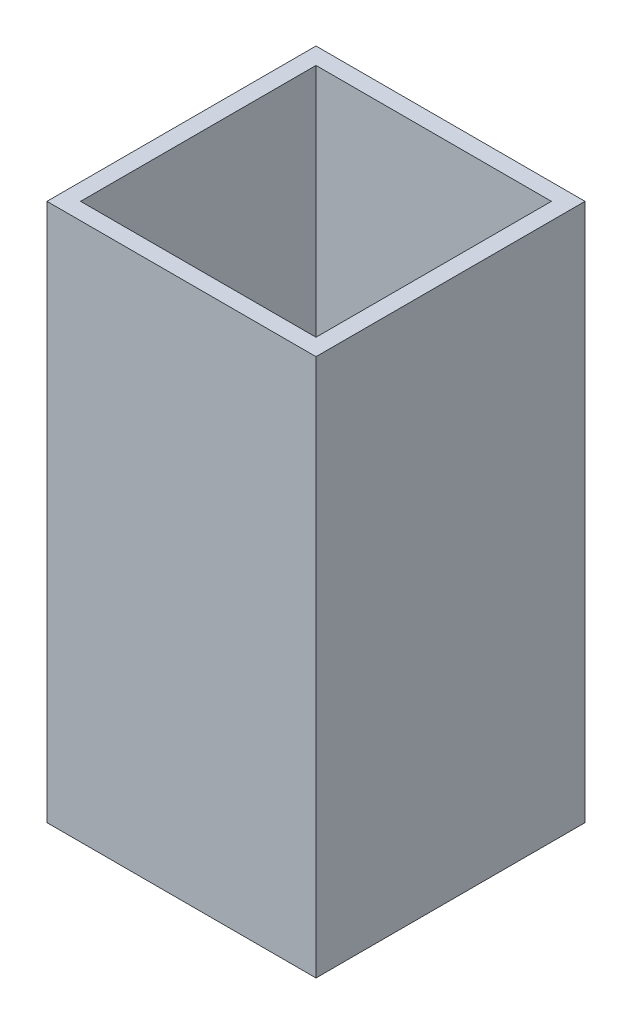
ISO-10303-21;
HEADER;
FILE_DESCRIPTION(('STEP AP214'),'2;1');
FILE_NAME('part.step','',(''),(''),'','','');
FILE_SCHEMA(('AUTOMOTIVE_DESIGN { 1 0 10303 214 1 1 1 1 }'));
ENDSEC;
DATA;
#1=APPLICATION_CONTEXT('core data for automotive mechanical design processes');
#2=APPLICATION_PROTOCOL_DEFINITION('international standard','automotive_design',2000,#1);
#3=PRODUCT_CONTEXT('',#1,'mechanical');
#4=PRODUCT('Part','Part','',(#3));
#5=PRODUCT_RELATED_PRODUCT_CATEGORY('part','',(#4));
#6=PRODUCT_DEFINITION_FORMATION('','',#4);
#7=PRODUCT_DEFINITION_CONTEXT('part definition',#1,'design');
#8=PRODUCT_DEFINITION('design','',#6,#7);
#9=PRODUCT_DEFINITION_SHAPE('','',#8);
#10=(LENGTH_UNIT() NAMED_UNIT(*) SI_UNIT(.MILLI.,.METRE.));
#11=(NAMED_UNIT(*) PLANE_ANGLE_UNIT() SI_UNIT($,.RADIAN.));
#12=(NAMED_UNIT(*) SI_UNIT($,.STERADIAN.) SOLID_ANGLE_UNIT());
#13=UNCERTAINTY_MEASURE_WITH_UNIT(LENGTH_MEASURE(1.E-05),#10,'distance_accuracy_value','');
#14=(GEOMETRIC_REPRESENTATION_CONTEXT(3) GLOBAL_UNCERTAINTY_ASSIGNED_CONTEXT((#13)) GLOBAL_UNIT_ASSIGNED_CONTEXT((#10,
#11,#12)) REPRESENTATION_CONTEXT('',''));
#15=CARTESIAN_POINT('',(0.,0.,0.));
#16=DIRECTION('',(0.,0.,1.));
#17=DIRECTION('',(1.,0.,0.));
#18=AXIS2_PLACEMENT_3D('',#15,#16,#17);
#19=CARTESIAN_POINT('',(0.,50.8,0.));
#20=DIRECTION('',(0.,-1.,0.));
#21=DIRECTION('',(0.,0.,-1.));
#22=AXIS2_PLACEMENT_3D('',#19,#20,#21);
#23=PLANE('',#22);
#24=DIRECTION('',(0.,0.,1.));
#25=VECTOR('',#24,1.);
#26=CARTESIAN_POINT('',(-12.7,50.8,-12.7));
#27=LINE('',#26,#25);
#28=CARTESIAN_POINT('',(-12.7,50.8,-12.7));
#29=VERTEX_POINT('',#28);
#30=CARTESIAN_POINT('',(-12.7,50.8,12.7));
#31=VERTEX_POINT('',#30);
#32=EDGE_CURVE('E134',#29,#31,#27,.T.);
#33=ORIENTED_EDGE('',*,*,#32,.T.);
#34=DIRECTION('',(1.,0.,0.));
#35=VECTOR('',#34,1.);
#36=CARTESIAN_POINT('',(12.7,50.8,12.7));
#37=LINE('',#36,#35);
#38=CARTESIAN_POINT('',(12.7,50.8,12.7));
#39=VERTEX_POINT('',#38);
#40=EDGE_CURVE('E137',#31,#39,#37,.T.);
#41=ORIENTED_EDGE('',*,*,#40,.T.);
#42=DIRECTION('',(0.,0.,-1.));
#43=VECTOR('',#42,1.);
#44=CARTESIAN_POINT('',(12.7,50.8,-12.7));
#45=LINE('',#44,#43);
#46=CARTESIAN_POINT('',(12.7,50.8,-12.7));
#47=VERTEX_POINT('',#46);
#48=EDGE_CURVE('E140',#39,#47,#45,.T.);
#49=ORIENTED_EDGE('',*,*,#48,.T.);
#50=DIRECTION('',(-1.,0.,0.));
#51=VECTOR('',#50,1.);
#52=CARTESIAN_POINT('',(12.7,50.8,-12.7));
#53=LINE('',#52,#51);
#54=EDGE_CURVE('E142',#47,#29,#53,.T.);
#55=ORIENTED_EDGE('',*,*,#54,.T.);
#56=EDGE_LOOP('',(#33,#41,#49,#55));
#57=FACE_BOUND('',#56,.T.);
#58=DIRECTION('',(0.,0.,1.));
#59=VECTOR('',#58,1.);
#60=CARTESIAN_POINT('',(-11.1125,50.8,-11.1125));
#61=LINE('',#60,#59);
#62=CARTESIAN_POINT('',(-11.1125,50.8,-11.1125));
#63=VERTEX_POINT('',#62);
#64=CARTESIAN_POINT('',(-11.1125,50.8,11.1125));
#65=VERTEX_POINT('',#64);
#66=EDGE_CURVE('E98',#63,#65,#61,.T.);
#67=ORIENTED_EDGE('',*,*,#66,.F.);
#68=DIRECTION('',(-1.,0.,0.));
#69=VECTOR('',#68,1.);
#70=CARTESIAN_POINT('',(11.1125,50.8,-11.1125));
#71=LINE('',#70,#69);
#72=CARTESIAN_POINT('',(11.1125,50.8,-11.1125));
#73=VERTEX_POINT('',#72);
#74=EDGE_CURVE('E120',#73,#63,#71,.T.);
#75=ORIENTED_EDGE('',*,*,#74,.F.);
#76=DIRECTION('',(0.,0.,-1.));
#77=VECTOR('',#76,1.);
#78=CARTESIAN_POINT('',(11.1125,50.8,-11.1125));
#79=LINE('',#78,#77);
#80=CARTESIAN_POINT('',(11.1125,50.8,11.1125));
#81=VERTEX_POINT('',#80);
#82=EDGE_CURVE('E118',#81,#73,#79,.T.);
#83=ORIENTED_EDGE('',*,*,#82,.F.);
#84=DIRECTION('',(1.,0.,0.));
#85=VECTOR('',#84,1.);
#86=CARTESIAN_POINT('',(11.1125,50.8,11.1125));
#87=LINE('',#86,#85);
#88=EDGE_CURVE('E106',#65,#81,#87,.T.);
#89=ORIENTED_EDGE('',*,*,#88,.F.);
#90=EDGE_LOOP('',(#67,#75,#83,#89));
#91=FACE_BOUND('',#90,.T.);
#92=ADVANCED_FACE('F33',(#57,#91),#23,.F.);
#93=CARTESIAN_POINT('',(0.,0.,0.));
#94=DIRECTION('',(0.,-1.,0.));
#95=DIRECTION('',(0.,0.,-1.));
#96=AXIS2_PLACEMENT_3D('',#93,#94,#95);
#97=PLANE('',#96);
#98=DIRECTION('',(0.,0.,1.));
#99=VECTOR('',#98,1.);
#100=CARTESIAN_POINT('',(-12.7,0.,-12.7));
#101=LINE('',#100,#99);
#102=CARTESIAN_POINT('',(-12.7,0.,-12.7));
#103=VERTEX_POINT('',#102);
#104=CARTESIAN_POINT('',(-12.7,0.,12.7));
#105=VERTEX_POINT('',#104);
#106=EDGE_CURVE('E114',#103,#105,#101,.T.);
#107=ORIENTED_EDGE('',*,*,#106,.F.);
#108=DIRECTION('',(-1.,0.,0.));
#109=VECTOR('',#108,1.);
#110=CARTESIAN_POINT('',(12.7,0.,-12.7));
#111=LINE('',#110,#109);
#112=CARTESIAN_POINT('',(12.7,0.,-12.7));
#113=VERTEX_POINT('',#112);
#114=EDGE_CURVE('E138',#113,#103,#111,.T.);
#115=ORIENTED_EDGE('',*,*,#114,.F.);
#116=DIRECTION('',(0.,0.,-1.));
#117=VECTOR('',#116,1.);
#118=CARTESIAN_POINT('',(12.7,0.,-12.7));
#119=LINE('',#118,#117);
#120=CARTESIAN_POINT('',(12.7,0.,12.7));
#121=VERTEX_POINT('',#120);
#122=EDGE_CURVE('E149',#121,#113,#119,.T.);
#123=ORIENTED_EDGE('',*,*,#122,.F.);
#124=DIRECTION('',(1.,0.,0.));
#125=VECTOR('',#124,1.);
#126=CARTESIAN_POINT('',(12.7,0.,12.7));
#127=LINE('',#126,#125);
#128=EDGE_CURVE('E147',#105,#121,#127,.T.);
#129=ORIENTED_EDGE('',*,*,#128,.F.);
#130=EDGE_LOOP('',(#107,#115,#123,#129));
#131=FACE_BOUND('',#130,.T.);
#132=DIRECTION('',(-1.,0.,0.));
#133=VECTOR('',#132,1.);
#134=CARTESIAN_POINT('',(11.1125,0.,-11.1125));
#135=LINE('',#134,#133);
#136=CARTESIAN_POINT('',(11.1125,0.,-11.1125));
#137=VERTEX_POINT('',#136);
#138=CARTESIAN_POINT('',(-11.1125,0.,-11.1125));
#139=VERTEX_POINT('',#138);
#140=EDGE_CURVE('E107',#137,#139,#135,.T.);
#141=ORIENTED_EDGE('',*,*,#140,.T.);
#142=DIRECTION('',(0.,0.,1.));
#143=VECTOR('',#142,1.);
#144=CARTESIAN_POINT('',(-11.1125,0.,-11.1125));
#145=LINE('',#144,#143);
#146=CARTESIAN_POINT('',(-11.1125,0.,11.1125));
#147=VERTEX_POINT('',#146);
#148=EDGE_CURVE('E56',#139,#147,#145,.T.);
#149=ORIENTED_EDGE('',*,*,#148,.T.);
#150=DIRECTION('',(1.,0.,0.));
#151=VECTOR('',#150,1.);
#152=CARTESIAN_POINT('',(11.1125,0.,11.1125));
#153=LINE('',#152,#151);
#154=CARTESIAN_POINT('',(11.1125,0.,11.1125));
#155=VERTEX_POINT('',#154);
#156=EDGE_CURVE('E113',#147,#155,#153,.T.);
#157=ORIENTED_EDGE('',*,*,#156,.T.);
#158=DIRECTION('',(0.,0.,-1.));
#159=VECTOR('',#158,1.);
#160=CARTESIAN_POINT('',(11.1125,0.,-11.1125));
#161=LINE('',#160,#159);
#162=EDGE_CURVE('E126',#155,#137,#161,.T.);
#163=ORIENTED_EDGE('',*,*,#162,.T.);
#164=EDGE_LOOP('',(#141,#149,#157,#163));
#165=FACE_BOUND('',#164,.T.);
#166=ADVANCED_FACE('F167',(#131,#165),#97,.T.);
#167=CARTESIAN_POINT('',(-12.7,50.8,-12.7));
#168=DIRECTION('',(1.,0.,0.));
#169=DIRECTION('',(0.,0.,-1.));
#170=AXIS2_PLACEMENT_3D('',#167,#168,#169);
#171=PLANE('',#170);
#172=ORIENTED_EDGE('',*,*,#106,.T.);
#173=DIRECTION('',(0.,-1.,0.));
#174=VECTOR('',#173,1.);
#175=CARTESIAN_POINT('',(-12.7,50.8,12.7));
#176=LINE('',#175,#174);
#177=EDGE_CURVE('E11',#31,#105,#176,.T.);
#178=ORIENTED_EDGE('',*,*,#177,.F.);
#179=ORIENTED_EDGE('',*,*,#32,.F.);
#180=DIRECTION('',(0.,-1.,0.));
#181=VECTOR('',#180,1.);
#182=CARTESIAN_POINT('',(-12.7,50.8,-12.7));
#183=LINE('',#182,#181);
#184=EDGE_CURVE('E144',#29,#103,#183,.T.);
#185=ORIENTED_EDGE('',*,*,#184,.T.);
#186=EDGE_LOOP('',(#172,#178,#179,#185));
#187=FACE_BOUND('',#186,.T.);
#188=ADVANCED_FACE('F35',(#187),#171,.F.);
#189=CARTESIAN_POINT('',(12.7,50.8,12.7));
#190=DIRECTION('',(0.,0.,-1.));
#191=DIRECTION('',(-1.,0.,0.));
#192=AXIS2_PLACEMENT_3D('',#189,#190,#191);
#193=PLANE('',#192);
#194=ORIENTED_EDGE('',*,*,#128,.T.);
#195=DIRECTION('',(0.,-1.,0.));
#196=VECTOR('',#195,1.);
#197=CARTESIAN_POINT('',(12.7,50.8,12.7));
#198=LINE('',#197,#196);
#199=EDGE_CURVE('E41',#39,#121,#198,.T.);
#200=ORIENTED_EDGE('',*,*,#199,.F.);
#201=ORIENTED_EDGE('',*,*,#40,.F.);
#202=ORIENTED_EDGE('',*,*,#177,.T.);
#203=EDGE_LOOP('',(#194,#200,#201,#202));
#204=FACE_BOUND('',#203,.T.);
#205=ADVANCED_FACE('F177',(#204),#193,.F.);
#206=CARTESIAN_POINT('',(12.7,50.8,-12.7));
#207=DIRECTION('',(-1.,0.,0.));
#208=DIRECTION('',(0.,0.,1.));
#209=AXIS2_PLACEMENT_3D('',#206,#207,#208);
#210=PLANE('',#209);
#211=ORIENTED_EDGE('',*,*,#122,.T.);
#212=DIRECTION('',(0.,-1.,0.));
#213=VECTOR('',#212,1.);
#214=CARTESIAN_POINT('',(12.7,50.8,-12.7));
#215=LINE('',#214,#213);
#216=EDGE_CURVE('E154',#47,#113,#215,.T.);
#217=ORIENTED_EDGE('',*,*,#216,.F.);
#218=ORIENTED_EDGE('',*,*,#48,.F.);
#219=ORIENTED_EDGE('',*,*,#199,.T.);
#220=EDGE_LOOP('',(#211,#217,#218,#219));
#221=FACE_BOUND('',#220,.T.);
#222=ADVANCED_FACE('F161',(#221),#210,.F.);
#223=CARTESIAN_POINT('',(12.7,50.8,-12.7));
#224=DIRECTION('',(0.,0.,1.));
#225=DIRECTION('',(1.,0.,0.));
#226=AXIS2_PLACEMENT_3D('',#223,#224,#225);
#227=PLANE('',#226);
#228=ORIENTED_EDGE('',*,*,#114,.T.);
#229=ORIENTED_EDGE('',*,*,#184,.F.);
#230=ORIENTED_EDGE('',*,*,#54,.F.);
#231=ORIENTED_EDGE('',*,*,#216,.T.);
#232=EDGE_LOOP('',(#228,#229,#230,#231));
#233=FACE_BOUND('',#232,.T.);
#234=ADVANCED_FACE('F171',(#233),#227,.F.);
#235=CARTESIAN_POINT('',(-11.1125,50.8,-11.1125));
#236=DIRECTION('',(1.,0.,0.));
#237=DIRECTION('',(0.,0.,-1.));
#238=AXIS2_PLACEMENT_3D('',#235,#236,#237);
#239=PLANE('',#238);
#240=ORIENTED_EDGE('',*,*,#148,.F.);
#241=DIRECTION('',(0.,-1.,0.));
#242=VECTOR('',#241,1.);
#243=CARTESIAN_POINT('',(-11.1125,50.8,-11.1125));
#244=LINE('',#243,#242);
#245=EDGE_CURVE('E102',#63,#139,#244,.T.);
#246=ORIENTED_EDGE('',*,*,#245,.F.);
#247=ORIENTED_EDGE('',*,*,#66,.T.);
#248=DIRECTION('',(0.,-1.,0.));
#249=VECTOR('',#248,1.);
#250=CARTESIAN_POINT('',(-11.1125,50.8,11.1125));
#251=LINE('',#250,#249);
#252=EDGE_CURVE('E101',#65,#147,#251,.T.);
#253=ORIENTED_EDGE('',*,*,#252,.T.);
#254=EDGE_LOOP('',(#240,#246,#247,#253));
#255=FACE_BOUND('',#254,.T.);
#256=ADVANCED_FACE('F100',(#255),#239,.T.);
#257=CARTESIAN_POINT('',(11.1125,50.8,11.1125));
#258=DIRECTION('',(0.,0.,-1.));
#259=DIRECTION('',(-1.,0.,0.));
#260=AXIS2_PLACEMENT_3D('',#257,#258,#259);
#261=PLANE('',#260);
#262=ORIENTED_EDGE('',*,*,#156,.F.);
#263=ORIENTED_EDGE('',*,*,#252,.F.);
#264=ORIENTED_EDGE('',*,*,#88,.T.);
#265=DIRECTION('',(0.,-1.,0.));
#266=VECTOR('',#265,1.);
#267=CARTESIAN_POINT('',(11.1125,50.8,11.1125));
#268=LINE('',#267,#266);
#269=EDGE_CURVE('E115',#81,#155,#268,.T.);
#270=ORIENTED_EDGE('',*,*,#269,.T.);
#271=EDGE_LOOP('',(#262,#263,#264,#270));
#272=FACE_BOUND('',#271,.T.);
#273=ADVANCED_FACE('F110',(#272),#261,.T.);
#274=CARTESIAN_POINT('',(11.1125,50.8,-11.1125));
#275=DIRECTION('',(-1.,0.,0.));
#276=DIRECTION('',(0.,0.,1.));
#277=AXIS2_PLACEMENT_3D('',#274,#275,#276);
#278=PLANE('',#277);
#279=ORIENTED_EDGE('',*,*,#162,.F.);
#280=ORIENTED_EDGE('',*,*,#269,.F.);
#281=ORIENTED_EDGE('',*,*,#82,.T.);
#282=DIRECTION('',(0.,-1.,0.));
#283=VECTOR('',#282,1.);
#284=CARTESIAN_POINT('',(11.1125,50.8,-11.1125));
#285=LINE('',#284,#283);
#286=EDGE_CURVE('E48',#73,#137,#285,.T.);
#287=ORIENTED_EDGE('',*,*,#286,.T.);
#288=EDGE_LOOP('',(#279,#280,#281,#287));
#289=FACE_BOUND('',#288,.T.);
#290=ADVANCED_FACE('F200',(#289),#278,.T.);
#291=CARTESIAN_POINT('',(11.1125,50.8,-11.1125));
#292=DIRECTION('',(0.,0.,1.));
#293=DIRECTION('',(1.,0.,0.));
#294=AXIS2_PLACEMENT_3D('',#291,#292,#293);
#295=PLANE('',#294);
#296=ORIENTED_EDGE('',*,*,#140,.F.);
#297=ORIENTED_EDGE('',*,*,#286,.F.);
#298=ORIENTED_EDGE('',*,*,#74,.T.);
#299=ORIENTED_EDGE('',*,*,#245,.T.);
#300=EDGE_LOOP('',(#296,#297,#298,#299));
#301=FACE_BOUND('',#300,.T.);
#302=ADVANCED_FACE('F204',(#301),#295,.T.);
#303=CLOSED_SHELL('',(#92,#166,#188,#205,#222,#234,#256,#273,#290,#302));
#304=MANIFOLD_SOLID_BREP('B2',#303);
#305=ADVANCED_BREP_SHAPE_REPRESENTATION('',(#18,#304),#14);
#306=SHAPE_DEFINITION_REPRESENTATION(#9,#305);
ENDSEC;
END-ISO-10303-21;
